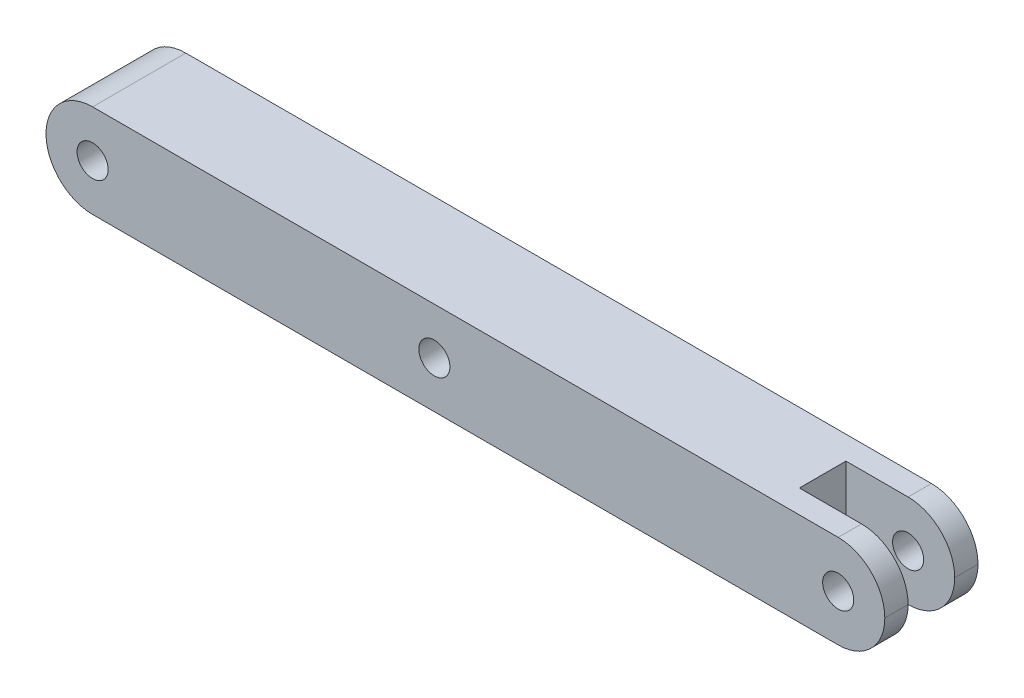
ISO-10303-21;
HEADER;
FILE_DESCRIPTION(('STEP AP214'),'2;1');
FILE_NAME('part.step','',(''),(''),'','','');
FILE_SCHEMA(('AUTOMOTIVE_DESIGN { 1 0 10303 214 1 1 1 1 }'));
ENDSEC;
DATA;
#1=APPLICATION_CONTEXT('core data for automotive mechanical design processes');
#2=APPLICATION_PROTOCOL_DEFINITION('international standard','automotive_design',2000,#1);
#3=PRODUCT_CONTEXT('',#1,'mechanical');
#4=PRODUCT('Part','Part','',(#3));
#5=PRODUCT_RELATED_PRODUCT_CATEGORY('part','',(#4));
#6=PRODUCT_DEFINITION_FORMATION('','',#4);
#7=PRODUCT_DEFINITION_CONTEXT('part definition',#1,'design');
#8=PRODUCT_DEFINITION('design','',#6,#7);
#9=PRODUCT_DEFINITION_SHAPE('','',#8);
#10=(LENGTH_UNIT() NAMED_UNIT(*) SI_UNIT(.MILLI.,.METRE.));
#11=(NAMED_UNIT(*) PLANE_ANGLE_UNIT() SI_UNIT($,.RADIAN.));
#12=(NAMED_UNIT(*) SI_UNIT($,.STERADIAN.) SOLID_ANGLE_UNIT());
#13=UNCERTAINTY_MEASURE_WITH_UNIT(LENGTH_MEASURE(1.E-05),#10,'distance_accuracy_value','');
#14=(GEOMETRIC_REPRESENTATION_CONTEXT(3) GLOBAL_UNCERTAINTY_ASSIGNED_CONTEXT((#13)) GLOBAL_UNIT_ASSIGNED_CONTEXT((#10,
#11,#12)) REPRESENTATION_CONTEXT('',''));
#15=CARTESIAN_POINT('',(0.,0.,0.));
#16=DIRECTION('',(0.,0.,1.));
#17=DIRECTION('',(1.,0.,0.));
#18=AXIS2_PLACEMENT_3D('',#15,#16,#17);
#19=CARTESIAN_POINT('',(270.,0.,15.));
#20=DIRECTION('',(0.,1.,0.));
#21=DIRECTION('',(-1.,0.,0.));
#22=AXIS2_PLACEMENT_3D('',#19,#20,#21);
#23=PLANE('',#22);
#24=DIRECTION('',(1.,0.,0.));
#25=VECTOR('',#24,1.);
#26=CARTESIAN_POINT('',(270.,0.,15.));
#27=LINE('',#26,#25);
#28=CARTESIAN_POINT('',(15.,0.,15.));
#29=VERTEX_POINT('',#28);
#30=CARTESIAN_POINT('',(255.,0.,15.));
#31=VERTEX_POINT('',#30);
#32=EDGE_CURVE('E150',#29,#31,#27,.T.);
#33=ORIENTED_EDGE('',*,*,#32,.F.);
#34=DIRECTION('',(0.,0.,-1.));
#35=VECTOR('',#34,1.);
#36=CARTESIAN_POINT('',(15.,0.,15.));
#37=LINE('',#36,#35);
#38=CARTESIAN_POINT('',(15.,0.,-15.));
#39=VERTEX_POINT('',#38);
#40=EDGE_CURVE('E171',#29,#39,#37,.T.);
#41=ORIENTED_EDGE('',*,*,#40,.T.);
#42=DIRECTION('',(1.,0.,0.));
#43=VECTOR('',#42,1.);
#44=CARTESIAN_POINT('',(270.,0.,-15.));
#45=LINE('',#44,#43);
#46=CARTESIAN_POINT('',(255.,0.,-15.));
#47=VERTEX_POINT('',#46);
#48=EDGE_CURVE('E149',#39,#47,#45,.T.);
#49=ORIENTED_EDGE('',*,*,#48,.T.);
#50=DIRECTION('',(0.,0.,-1.));
#51=VECTOR('',#50,1.);
#52=CARTESIAN_POINT('',(255.,0.,15.));
#53=LINE('',#52,#51);
#54=CARTESIAN_POINT('',(255.,0.,-7.50000000000001));
#55=VERTEX_POINT('',#54);
#56=EDGE_CURVE('E168',#47,#55,#53,.F.);
#57=ORIENTED_EDGE('',*,*,#56,.T.);
#58=DIRECTION('',(1.,0.,0.));
#59=VECTOR('',#58,1.);
#60=CARTESIAN_POINT('',(270.,0.,-7.50000000000001));
#61=LINE('',#60,#59);
#62=CARTESIAN_POINT('',(235.,0.,-7.5));
#63=VERTEX_POINT('',#62);
#64=EDGE_CURVE('E146',#63,#55,#61,.T.);
#65=ORIENTED_EDGE('',*,*,#64,.F.);
#66=DIRECTION('',(0.,0.,-1.));
#67=VECTOR('',#66,1.);
#68=CARTESIAN_POINT('',(235.,0.,-7.5));
#69=LINE('',#68,#67);
#70=CARTESIAN_POINT('',(235.,0.,7.49999999999998));
#71=VERTEX_POINT('',#70);
#72=EDGE_CURVE('E135',#71,#63,#69,.T.);
#73=ORIENTED_EDGE('',*,*,#72,.F.);
#74=DIRECTION('',(-1.,0.,0.));
#75=VECTOR('',#74,1.);
#76=CARTESIAN_POINT('',(235.,0.,7.49999999999998));
#77=LINE('',#76,#75);
#78=CARTESIAN_POINT('',(255.,0.,7.49999999999998));
#79=VERTEX_POINT('',#78);
#80=EDGE_CURVE('E127',#79,#71,#77,.T.);
#81=ORIENTED_EDGE('',*,*,#80,.F.);
#82=DIRECTION('',(0.,0.,-1.));
#83=VECTOR('',#82,1.);
#84=CARTESIAN_POINT('',(255.,0.,15.));
#85=LINE('',#84,#83);
#86=EDGE_CURVE('E157',#79,#31,#85,.F.);
#87=ORIENTED_EDGE('',*,*,#86,.T.);
#88=EDGE_LOOP('',(#33,#41,#49,#57,#65,#73,#81,#87));
#89=FACE_BOUND('',#88,.T.);
#90=ADVANCED_FACE('F35',(#89),#23,.F.);
#91=CARTESIAN_POINT('',(0.,30.,15.));
#92=DIRECTION('',(0.,-1.,0.));
#93=DIRECTION('',(0.,0.,-1.));
#94=AXIS2_PLACEMENT_3D('',#91,#92,#93);
#95=PLANE('',#94);
#96=DIRECTION('',(-1.,0.,0.));
#97=VECTOR('',#96,1.);
#98=CARTESIAN_POINT('',(0.,30.,-15.));
#99=LINE('',#98,#97);
#100=CARTESIAN_POINT('',(255.,30.,-15.));
#101=VERTEX_POINT('',#100);
#102=CARTESIAN_POINT('',(15.,30.,-15.));
#103=VERTEX_POINT('',#102);
#104=EDGE_CURVE('E154',#101,#103,#99,.T.);
#105=ORIENTED_EDGE('',*,*,#104,.T.);
#106=DIRECTION('',(0.,0.,-1.));
#107=VECTOR('',#106,1.);
#108=CARTESIAN_POINT('',(15.,30.,15.));
#109=LINE('',#108,#107);
#110=CARTESIAN_POINT('',(15.,30.,15.));
#111=VERTEX_POINT('',#110);
#112=EDGE_CURVE('E194',#103,#111,#109,.F.);
#113=ORIENTED_EDGE('',*,*,#112,.T.);
#114=DIRECTION('',(-1.,0.,0.));
#115=VECTOR('',#114,1.);
#116=CARTESIAN_POINT('',(0.,30.,15.));
#117=LINE('',#116,#115);
#118=CARTESIAN_POINT('',(255.,30.,15.));
#119=VERTEX_POINT('',#118);
#120=EDGE_CURVE('E153',#119,#111,#117,.T.);
#121=ORIENTED_EDGE('',*,*,#120,.F.);
#122=DIRECTION('',(0.,0.,-1.));
#123=VECTOR('',#122,1.);
#124=CARTESIAN_POINT('',(255.,30.,15.));
#125=LINE('',#124,#123);
#126=CARTESIAN_POINT('',(255.,30.,7.49999999999998));
#127=VERTEX_POINT('',#126);
#128=EDGE_CURVE('E190',#119,#127,#125,.T.);
#129=ORIENTED_EDGE('',*,*,#128,.T.);
#130=DIRECTION('',(1.,0.,0.));
#131=VECTOR('',#130,1.);
#132=CARTESIAN_POINT('',(235.,30.,7.49999999999998));
#133=LINE('',#132,#131);
#134=CARTESIAN_POINT('',(235.,30.,7.49999999999998));
#135=VERTEX_POINT('',#134);
#136=EDGE_CURVE('E138',#135,#127,#133,.T.);
#137=ORIENTED_EDGE('',*,*,#136,.F.);
#138=DIRECTION('',(0.,0.,1.));
#139=VECTOR('',#138,1.);
#140=CARTESIAN_POINT('',(235.,30.,-7.5));
#141=LINE('',#140,#139);
#142=CARTESIAN_POINT('',(235.,30.,-7.5));
#143=VERTEX_POINT('',#142);
#144=EDGE_CURVE('E126',#143,#135,#141,.T.);
#145=ORIENTED_EDGE('',*,*,#144,.F.);
#146=DIRECTION('',(-1.,0.,0.));
#147=VECTOR('',#146,1.);
#148=CARTESIAN_POINT('',(270.,30.,-7.50000000000001));
#149=LINE('',#148,#147);
#150=CARTESIAN_POINT('',(255.,30.,-7.50000000000001));
#151=VERTEX_POINT('',#150);
#152=EDGE_CURVE('E117',#151,#143,#149,.T.);
#153=ORIENTED_EDGE('',*,*,#152,.F.);
#154=DIRECTION('',(0.,0.,-1.));
#155=VECTOR('',#154,1.);
#156=CARTESIAN_POINT('',(255.,30.,15.));
#157=LINE('',#156,#155);
#158=EDGE_CURVE('E192',#151,#101,#157,.T.);
#159=ORIENTED_EDGE('',*,*,#158,.T.);
#160=EDGE_LOOP('',(#105,#113,#121,#129,#137,#145,#153,#159));
#161=FACE_BOUND('',#160,.T.);
#162=ADVANCED_FACE('F141',(#161),#95,.F.);
#163=CARTESIAN_POINT('',(0.,0.,15.));
#164=DIRECTION('',(0.,0.,-1.));
#165=DIRECTION('',(-1.,0.,0.));
#166=AXIS2_PLACEMENT_3D('',#163,#164,#165);
#167=PLANE('',#166);
#168=CARTESIAN_POINT('',(15.,15.,15.));
#169=DIRECTION('',(0.,0.,-1.));
#170=DIRECTION('',(-1.,0.,0.));
#171=AXIS2_PLACEMENT_3D('',#168,#169,#170);
#172=CIRCLE('',#171,5.);
#173=CARTESIAN_POINT('',(10.,15.,15.));
#174=VERTEX_POINT('',#173);
#175=EDGE_CURVE('E313',#174,#174,#172,.T.);
#176=ORIENTED_EDGE('',*,*,#175,.T.);
#177=EDGE_LOOP('',(#176));
#178=FACE_BOUND('',#177,.T.);
#179=CARTESIAN_POINT('',(125.,15.,15.));
#180=DIRECTION('',(0.,0.,-1.));
#181=DIRECTION('',(-1.,0.,0.));
#182=AXIS2_PLACEMENT_3D('',#179,#180,#181);
#183=CIRCLE('',#182,4.99999999999999);
#184=CARTESIAN_POINT('',(120.,15.,15.));
#185=VERTEX_POINT('',#184);
#186=EDGE_CURVE('E310',#185,#185,#183,.T.);
#187=ORIENTED_EDGE('',*,*,#186,.T.);
#188=EDGE_LOOP('',(#187));
#189=FACE_BOUND('',#188,.T.);
#190=CARTESIAN_POINT('',(255.,15.,15.));
#191=DIRECTION('',(0.,0.,-1.));
#192=DIRECTION('',(-1.,0.,0.));
#193=AXIS2_PLACEMENT_3D('',#190,#191,#192);
#194=CIRCLE('',#193,5.00000000000005);
#195=CARTESIAN_POINT('',(250.,15.,15.));
#196=VERTEX_POINT('',#195);
#197=EDGE_CURVE('E307',#196,#196,#194,.T.);
#198=ORIENTED_EDGE('',*,*,#197,.T.);
#199=EDGE_LOOP('',(#198));
#200=FACE_BOUND('',#199,.T.);
#201=CARTESIAN_POINT('',(15.,15.,15.));
#202=DIRECTION('',(0.,0.,-1.));
#203=DIRECTION('',(-1.,0.,0.));
#204=AXIS2_PLACEMENT_3D('',#201,#202,#203);
#205=CIRCLE('',#204,15.);
#206=CARTESIAN_POINT('',(0.,15.,15.));
#207=VERTEX_POINT('',#206);
#208=EDGE_CURVE('E186',#111,#207,#205,.F.);
#209=ORIENTED_EDGE('',*,*,#208,.T.);
#210=CARTESIAN_POINT('',(15.,15.,15.));
#211=DIRECTION('',(0.,0.,-1.));
#212=DIRECTION('',(-1.,0.,0.));
#213=AXIS2_PLACEMENT_3D('',#210,#211,#212);
#214=CIRCLE('',#213,15.);
#215=EDGE_CURVE('E188',#207,#29,#214,.F.);
#216=ORIENTED_EDGE('',*,*,#215,.T.);
#217=ORIENTED_EDGE('',*,*,#32,.T.);
#218=CARTESIAN_POINT('',(255.,15.,15.));
#219=DIRECTION('',(0.,0.,-1.));
#220=DIRECTION('',(-1.,0.,0.));
#221=AXIS2_PLACEMENT_3D('',#218,#219,#220);
#222=CIRCLE('',#221,15.);
#223=CARTESIAN_POINT('',(270.,15.,15.));
#224=VERTEX_POINT('',#223);
#225=EDGE_CURVE('E184',#31,#224,#222,.F.);
#226=ORIENTED_EDGE('',*,*,#225,.T.);
#227=CARTESIAN_POINT('',(255.,15.,15.));
#228=DIRECTION('',(0.,0.,-1.));
#229=DIRECTION('',(-1.,0.,0.));
#230=AXIS2_PLACEMENT_3D('',#227,#228,#229);
#231=CIRCLE('',#230,15.);
#232=EDGE_CURVE('E182',#224,#119,#231,.F.);
#233=ORIENTED_EDGE('',*,*,#232,.T.);
#234=ORIENTED_EDGE('',*,*,#120,.T.);
#235=EDGE_LOOP('',(#209,#216,#217,#226,#233,#234));
#236=FACE_BOUND('',#235,.T.);
#237=ADVANCED_FACE('F217',(#178,#189,#200,#236),#167,.F.);
#238=CARTESIAN_POINT('',(0.,0.,-15.));
#239=DIRECTION('',(0.,0.,-1.));
#240=DIRECTION('',(-1.,0.,0.));
#241=AXIS2_PLACEMENT_3D('',#238,#239,#240);
#242=PLANE('',#241);
#243=CARTESIAN_POINT('',(15.,15.,-15.));
#244=DIRECTION('',(0.,0.,1.));
#245=DIRECTION('',(1.,0.,0.));
#246=AXIS2_PLACEMENT_3D('',#243,#244,#245);
#247=CIRCLE('',#246,5.);
#248=CARTESIAN_POINT('',(20.,15.,-15.));
#249=VERTEX_POINT('',#248);
#250=EDGE_CURVE('E165',#249,#249,#247,.T.);
#251=ORIENTED_EDGE('',*,*,#250,.T.);
#252=EDGE_LOOP('',(#251));
#253=FACE_BOUND('',#252,.T.);
#254=CARTESIAN_POINT('',(125.,15.,-15.));
#255=DIRECTION('',(0.,0.,1.));
#256=DIRECTION('',(1.,0.,0.));
#257=AXIS2_PLACEMENT_3D('',#254,#255,#256);
#258=CIRCLE('',#257,4.99999999999999);
#259=CARTESIAN_POINT('',(130.,15.,-15.));
#260=VERTEX_POINT('',#259);
#261=EDGE_CURVE('E297',#260,#260,#258,.T.);
#262=ORIENTED_EDGE('',*,*,#261,.T.);
#263=EDGE_LOOP('',(#262));
#264=FACE_BOUND('',#263,.T.);
#265=CARTESIAN_POINT('',(255.,15.,-15.));
#266=DIRECTION('',(0.,0.,1.));
#267=DIRECTION('',(1.,0.,0.));
#268=AXIS2_PLACEMENT_3D('',#265,#266,#267);
#269=CIRCLE('',#268,5.00000000000005);
#270=CARTESIAN_POINT('',(260.,15.,-15.));
#271=VERTEX_POINT('',#270);
#272=EDGE_CURVE('E201',#271,#271,#269,.T.);
#273=ORIENTED_EDGE('',*,*,#272,.T.);
#274=EDGE_LOOP('',(#273));
#275=FACE_BOUND('',#274,.T.);
#276=ORIENTED_EDGE('',*,*,#48,.F.);
#277=CARTESIAN_POINT('',(15.,15.,-15.));
#278=DIRECTION('',(0.,0.,-1.));
#279=DIRECTION('',(-1.,0.,0.));
#280=AXIS2_PLACEMENT_3D('',#277,#278,#279);
#281=CIRCLE('',#280,15.);
#282=CARTESIAN_POINT('',(0.,15.,-15.));
#283=VERTEX_POINT('',#282);
#284=EDGE_CURVE('E180',#39,#283,#281,.T.);
#285=ORIENTED_EDGE('',*,*,#284,.T.);
#286=CARTESIAN_POINT('',(15.,15.,-15.));
#287=DIRECTION('',(0.,0.,-1.));
#288=DIRECTION('',(-1.,0.,0.));
#289=AXIS2_PLACEMENT_3D('',#286,#287,#288);
#290=CIRCLE('',#289,15.);
#291=EDGE_CURVE('E178',#283,#103,#290,.T.);
#292=ORIENTED_EDGE('',*,*,#291,.T.);
#293=ORIENTED_EDGE('',*,*,#104,.F.);
#294=CARTESIAN_POINT('',(255.,15.,-15.));
#295=DIRECTION('',(0.,0.,-1.));
#296=DIRECTION('',(-1.,0.,0.));
#297=AXIS2_PLACEMENT_3D('',#294,#295,#296);
#298=CIRCLE('',#297,15.);
#299=CARTESIAN_POINT('',(270.,15.,-15.));
#300=VERTEX_POINT('',#299);
#301=EDGE_CURVE('E174',#101,#300,#298,.T.);
#302=ORIENTED_EDGE('',*,*,#301,.T.);
#303=CARTESIAN_POINT('',(255.,15.,-15.));
#304=DIRECTION('',(0.,0.,-1.));
#305=DIRECTION('',(-1.,0.,0.));
#306=AXIS2_PLACEMENT_3D('',#303,#304,#305);
#307=CIRCLE('',#306,15.);
#308=EDGE_CURVE('E176',#300,#47,#307,.T.);
#309=ORIENTED_EDGE('',*,*,#308,.T.);
#310=EDGE_LOOP('',(#276,#285,#292,#293,#302,#309));
#311=FACE_BOUND('',#310,.T.);
#312=ADVANCED_FACE('F234',(#253,#264,#275,#311),#242,.T.);
#313=CARTESIAN_POINT('',(235.,-0.001000000000001,7.49999999999998));
#314=DIRECTION('',(0.,0.,1.));
#315=DIRECTION('',(1.,0.,0.));
#316=AXIS2_PLACEMENT_3D('',#313,#314,#315);
#317=PLANE('',#316);
#318=CARTESIAN_POINT('',(255.,15.,7.49999999999999));
#319=DIRECTION('',(0.,0.,1.));
#320=DIRECTION('',(1.,0.,0.));
#321=AXIS2_PLACEMENT_3D('',#318,#319,#320);
#322=CIRCLE('',#321,5.00000000000005);
#323=CARTESIAN_POINT('',(260.,15.,7.49999999999999));
#324=VERTEX_POINT('',#323);
#325=EDGE_CURVE('E164',#324,#324,#322,.T.);
#326=ORIENTED_EDGE('',*,*,#325,.T.);
#327=EDGE_LOOP('',(#326));
#328=FACE_BOUND('',#327,.T.);
#329=CARTESIAN_POINT('',(255.,15.,7.49999999999998));
#330=DIRECTION('',(0.,0.,1.));
#331=DIRECTION('',(1.,0.,0.));
#332=AXIS2_PLACEMENT_3D('',#329,#330,#331);
#333=CIRCLE('',#332,15.);
#334=CARTESIAN_POINT('',(270.,15.,7.49999999999998));
#335=VERTEX_POINT('',#334);
#336=EDGE_CURVE('E44',#127,#335,#333,.F.);
#337=ORIENTED_EDGE('',*,*,#336,.T.);
#338=CARTESIAN_POINT('',(255.,15.,7.49999999999998));
#339=DIRECTION('',(0.,0.,1.));
#340=DIRECTION('',(1.,0.,0.));
#341=AXIS2_PLACEMENT_3D('',#338,#339,#340);
#342=CIRCLE('',#341,15.);
#343=EDGE_CURVE('E11',#335,#79,#342,.F.);
#344=ORIENTED_EDGE('',*,*,#343,.T.);
#345=ORIENTED_EDGE('',*,*,#80,.T.);
#346=DIRECTION('',(0.,1.,0.));
#347=VECTOR('',#346,1.);
#348=CARTESIAN_POINT('',(235.,-0.001000000000001,7.49999999999998));
#349=LINE('',#348,#347);
#350=EDGE_CURVE('E137',#71,#135,#349,.T.);
#351=ORIENTED_EDGE('',*,*,#350,.T.);
#352=ORIENTED_EDGE('',*,*,#136,.T.);
#353=EDGE_LOOP('',(#337,#344,#345,#351,#352));
#354=FACE_BOUND('',#353,.T.);
#355=ADVANCED_FACE('F277',(#328,#354),#317,.F.);
#356=CARTESIAN_POINT('',(235.,-0.001000000000001,-7.5));
#357=DIRECTION('',(-1.,0.,0.));
#358=DIRECTION('',(0.,0.,1.));
#359=AXIS2_PLACEMENT_3D('',#356,#357,#358);
#360=PLANE('',#359);
#361=ORIENTED_EDGE('',*,*,#72,.T.);
#362=DIRECTION('',(0.,1.,0.));
#363=VECTOR('',#362,1.);
#364=CARTESIAN_POINT('',(235.,-0.001000000000001,-7.5));
#365=LINE('',#364,#363);
#366=EDGE_CURVE('E120',#63,#143,#365,.T.);
#367=ORIENTED_EDGE('',*,*,#366,.T.);
#368=ORIENTED_EDGE('',*,*,#144,.T.);
#369=ORIENTED_EDGE('',*,*,#350,.F.);
#370=EDGE_LOOP('',(#361,#367,#368,#369));
#371=FACE_BOUND('',#370,.T.);
#372=ADVANCED_FACE('F131',(#371),#360,.F.);
#373=CARTESIAN_POINT('',(270.,-0.001000000000001,-7.50000000000001));
#374=DIRECTION('',(0.,0.,-1.));
#375=DIRECTION('',(-1.,0.,0.));
#376=AXIS2_PLACEMENT_3D('',#373,#374,#375);
#377=PLANE('',#376);
#378=CARTESIAN_POINT('',(255.,15.,-7.50000000000001));
#379=DIRECTION('',(0.,0.,-1.));
#380=DIRECTION('',(-1.,0.,0.));
#381=AXIS2_PLACEMENT_3D('',#378,#379,#380);
#382=CIRCLE('',#381,5.00000000000005);
#383=CARTESIAN_POINT('',(250.,15.,-7.5));
#384=VERTEX_POINT('',#383);
#385=EDGE_CURVE('E161',#384,#384,#382,.T.);
#386=ORIENTED_EDGE('',*,*,#385,.T.);
#387=EDGE_LOOP('',(#386));
#388=FACE_BOUND('',#387,.T.);
#389=ORIENTED_EDGE('',*,*,#64,.T.);
#390=CARTESIAN_POINT('',(255.,15.,-7.50000000000001));
#391=DIRECTION('',(0.,0.,-1.));
#392=DIRECTION('',(-1.,0.,0.));
#393=AXIS2_PLACEMENT_3D('',#390,#391,#392);
#394=CIRCLE('',#393,15.);
#395=CARTESIAN_POINT('',(270.,15.,-7.50000000000001));
#396=VERTEX_POINT('',#395);
#397=EDGE_CURVE('E58',#55,#396,#394,.F.);
#398=ORIENTED_EDGE('',*,*,#397,.T.);
#399=CARTESIAN_POINT('',(255.,15.,-7.50000000000001));
#400=DIRECTION('',(0.,0.,-1.));
#401=DIRECTION('',(-1.,0.,0.));
#402=AXIS2_PLACEMENT_3D('',#399,#400,#401);
#403=CIRCLE('',#402,15.);
#404=EDGE_CURVE('E122',#396,#151,#403,.F.);
#405=ORIENTED_EDGE('',*,*,#404,.T.);
#406=ORIENTED_EDGE('',*,*,#152,.T.);
#407=ORIENTED_EDGE('',*,*,#366,.F.);
#408=EDGE_LOOP('',(#389,#398,#405,#406,#407));
#409=FACE_BOUND('',#408,.T.);
#410=ADVANCED_FACE('F119',(#388,#409),#377,.F.);
#411=CARTESIAN_POINT('',(255.,15.,-15.));
#412=DIRECTION('',(0.,0.,1.));
#413=DIRECTION('',(1.,0.,0.));
#414=AXIS2_PLACEMENT_3D('',#411,#412,#413);
#415=CYLINDRICAL_SURFACE('',#414,5.00000000000005);
#416=ORIENTED_EDGE('',*,*,#272,.F.);
#417=EDGE_LOOP('',(#416));
#418=FACE_BOUND('',#417,.T.);
#419=ORIENTED_EDGE('',*,*,#385,.F.);
#420=EDGE_LOOP('',(#419));
#421=FACE_BOUND('',#420,.T.);
#422=ADVANCED_FACE('F275',(#418,#421),#415,.F.);
#423=ORIENTED_EDGE('',*,*,#325,.F.);
#424=EDGE_LOOP('',(#423));
#425=FACE_BOUND('',#424,.T.);
#426=ORIENTED_EDGE('',*,*,#197,.F.);
#427=EDGE_LOOP('',(#426));
#428=FACE_BOUND('',#427,.T.);
#429=ADVANCED_FACE('F267',(#425,#428),#415,.F.);
#430=CARTESIAN_POINT('',(125.,15.,-15.));
#431=DIRECTION('',(0.,0.,1.));
#432=DIRECTION('',(1.,0.,0.));
#433=AXIS2_PLACEMENT_3D('',#430,#431,#432);
#434=CYLINDRICAL_SURFACE('',#433,4.99999999999999);
#435=ORIENTED_EDGE('',*,*,#261,.F.);
#436=EDGE_LOOP('',(#435));
#437=FACE_BOUND('',#436,.T.);
#438=ORIENTED_EDGE('',*,*,#186,.F.);
#439=EDGE_LOOP('',(#438));
#440=FACE_BOUND('',#439,.T.);
#441=ADVANCED_FACE('F261',(#437,#440),#434,.F.);
#442=CARTESIAN_POINT('',(15.,15.,-15.));
#443=DIRECTION('',(0.,0.,1.));
#444=DIRECTION('',(1.,0.,0.));
#445=AXIS2_PLACEMENT_3D('',#442,#443,#444);
#446=CYLINDRICAL_SURFACE('',#445,5.);
#447=ORIENTED_EDGE('',*,*,#250,.F.);
#448=EDGE_LOOP('',(#447));
#449=FACE_BOUND('',#448,.T.);
#450=ORIENTED_EDGE('',*,*,#175,.F.);
#451=EDGE_LOOP('',(#450));
#452=FACE_BOUND('',#451,.T.);
#453=ADVANCED_FACE('F257',(#449,#452),#446,.F.);
#454=CARTESIAN_POINT('',(15.,15.,15.));
#455=DIRECTION('',(0.,0.,-1.));
#456=DIRECTION('',(-1.,0.,0.));
#457=AXIS2_PLACEMENT_3D('',#454,#455,#456);
#458=CYLINDRICAL_SURFACE('',#457,15.);
#459=DIRECTION('',(0.,0.,-1.));
#460=VECTOR('',#459,1.);
#461=CARTESIAN_POINT('',(0.,15.,15.));
#462=LINE('',#461,#460);
#463=EDGE_CURVE('E199',#207,#283,#462,.T.);
#464=ORIENTED_EDGE('',*,*,#463,.F.);
#465=ORIENTED_EDGE('',*,*,#208,.F.);
#466=ORIENTED_EDGE('',*,*,#112,.F.);
#467=ORIENTED_EDGE('',*,*,#291,.F.);
#468=EDGE_LOOP('',(#464,#465,#466,#467));
#469=FACE_BOUND('',#468,.T.);
#470=ADVANCED_FACE('F224',(#469),#458,.T.);
#471=CARTESIAN_POINT('',(15.,15.,15.));
#472=DIRECTION('',(0.,0.,-1.));
#473=DIRECTION('',(-1.,0.,0.));
#474=AXIS2_PLACEMENT_3D('',#471,#472,#473);
#475=CYLINDRICAL_SURFACE('',#474,15.);
#476=ORIENTED_EDGE('',*,*,#215,.F.);
#477=ORIENTED_EDGE('',*,*,#463,.T.);
#478=ORIENTED_EDGE('',*,*,#284,.F.);
#479=ORIENTED_EDGE('',*,*,#40,.F.);
#480=EDGE_LOOP('',(#476,#477,#478,#479));
#481=FACE_BOUND('',#480,.T.);
#482=ADVANCED_FACE('F232',(#481),#475,.T.);
#483=CARTESIAN_POINT('',(255.,15.,15.));
#484=DIRECTION('',(0.,0.,-1.));
#485=DIRECTION('',(-1.,0.,0.));
#486=AXIS2_PLACEMENT_3D('',#483,#484,#485);
#487=CYLINDRICAL_SURFACE('',#486,15.);
#488=ORIENTED_EDGE('',*,*,#158,.F.);
#489=ORIENTED_EDGE('',*,*,#404,.F.);
#490=DIRECTION('',(0.,0.,-1.));
#491=VECTOR('',#490,1.);
#492=CARTESIAN_POINT('',(270.,15.,15.));
#493=LINE('',#492,#491);
#494=EDGE_CURVE('E202',#300,#396,#493,.F.);
#495=ORIENTED_EDGE('',*,*,#494,.F.);
#496=ORIENTED_EDGE('',*,*,#301,.F.);
#497=EDGE_LOOP('',(#488,#489,#495,#496));
#498=FACE_BOUND('',#497,.T.);
#499=ADVANCED_FACE('F238',(#498),#487,.T.);
#500=CARTESIAN_POINT('',(255.,15.,15.));
#501=DIRECTION('',(0.,0.,-1.));
#502=DIRECTION('',(-1.,0.,0.));
#503=AXIS2_PLACEMENT_3D('',#500,#501,#502);
#504=CYLINDRICAL_SURFACE('',#503,15.);
#505=ORIENTED_EDGE('',*,*,#397,.F.);
#506=ORIENTED_EDGE('',*,*,#56,.F.);
#507=ORIENTED_EDGE('',*,*,#308,.F.);
#508=ORIENTED_EDGE('',*,*,#494,.T.);
#509=EDGE_LOOP('',(#505,#506,#507,#508));
#510=FACE_BOUND('',#509,.T.);
#511=ADVANCED_FACE('F236',(#510),#504,.T.);
#512=CARTESIAN_POINT('',(255.,15.,15.));
#513=DIRECTION('',(0.,0.,-1.));
#514=DIRECTION('',(-1.,0.,0.));
#515=AXIS2_PLACEMENT_3D('',#512,#513,#514);
#516=CYLINDRICAL_SURFACE('',#515,15.);
#517=ORIENTED_EDGE('',*,*,#128,.F.);
#518=ORIENTED_EDGE('',*,*,#232,.F.);
#519=DIRECTION('',(0.,0.,-1.));
#520=VECTOR('',#519,1.);
#521=CARTESIAN_POINT('',(270.,15.,15.));
#522=LINE('',#521,#520);
#523=EDGE_CURVE('E39',#335,#224,#522,.F.);
#524=ORIENTED_EDGE('',*,*,#523,.F.);
#525=ORIENTED_EDGE('',*,*,#336,.F.);
#526=EDGE_LOOP('',(#517,#518,#524,#525));
#527=FACE_BOUND('',#526,.T.);
#528=ADVANCED_FACE('F37',(#527),#516,.T.);
#529=CARTESIAN_POINT('',(255.,15.,15.));
#530=DIRECTION('',(0.,0.,-1.));
#531=DIRECTION('',(-1.,0.,0.));
#532=AXIS2_PLACEMENT_3D('',#529,#530,#531);
#533=CYLINDRICAL_SURFACE('',#532,15.);
#534=ORIENTED_EDGE('',*,*,#225,.F.);
#535=ORIENTED_EDGE('',*,*,#86,.F.);
#536=ORIENTED_EDGE('',*,*,#343,.F.);
#537=ORIENTED_EDGE('',*,*,#523,.T.);
#538=EDGE_LOOP('',(#534,#535,#536,#537));
#539=FACE_BOUND('',#538,.T.);
#540=ADVANCED_FACE('F210',(#539),#533,.T.);
#541=CLOSED_SHELL('',(#90,#162,#237,#312,#355,#372,#410,#422,#429,#441,#453,#470,#482,#499,#511,
#528,#540));
#542=MANIFOLD_SOLID_BREP('B2',#541);
#543=ADVANCED_BREP_SHAPE_REPRESENTATION('',(#18,#542),#14);
#544=SHAPE_DEFINITION_REPRESENTATION(#9,#543);
ENDSEC;
END-ISO-10303-21;
